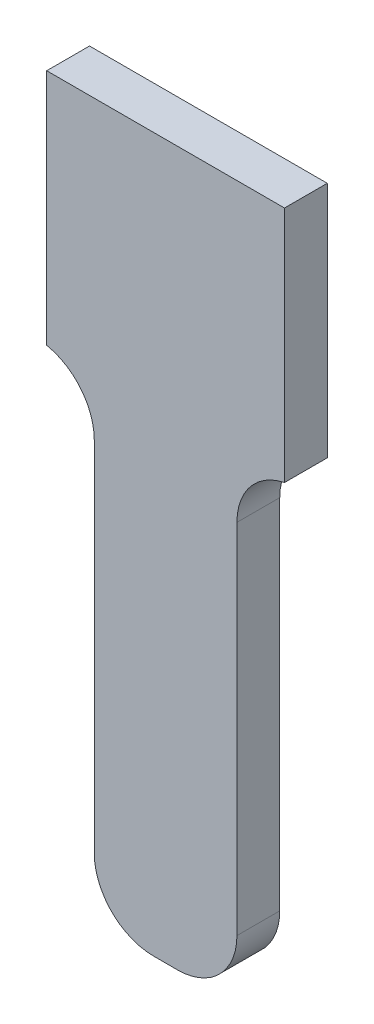
ISO-10303-21;
HEADER;
FILE_DESCRIPTION(('STEP AP214'),'2;1');
FILE_NAME('part.step','',(''),(''),'','','');
FILE_SCHEMA(('AUTOMOTIVE_DESIGN { 1 0 10303 214 1 1 1 1 }'));
ENDSEC;
DATA;
#1=APPLICATION_CONTEXT('core data for automotive mechanical design processes');
#2=APPLICATION_PROTOCOL_DEFINITION('international standard','automotive_design',2000,#1);
#3=PRODUCT_CONTEXT('',#1,'mechanical');
#4=PRODUCT('Part','Part','',(#3));
#5=PRODUCT_RELATED_PRODUCT_CATEGORY('part','',(#4));
#6=PRODUCT_DEFINITION_FORMATION('','',#4);
#7=PRODUCT_DEFINITION_CONTEXT('part definition',#1,'design');
#8=PRODUCT_DEFINITION('design','',#6,#7);
#9=PRODUCT_DEFINITION_SHAPE('','',#8);
#10=(LENGTH_UNIT() NAMED_UNIT(*) SI_UNIT(.MILLI.,.METRE.));
#11=(NAMED_UNIT(*) PLANE_ANGLE_UNIT() SI_UNIT($,.RADIAN.));
#12=(NAMED_UNIT(*) SI_UNIT($,.STERADIAN.) SOLID_ANGLE_UNIT());
#13=UNCERTAINTY_MEASURE_WITH_UNIT(LENGTH_MEASURE(1.E-05),#10,'distance_accuracy_value','');
#14=(GEOMETRIC_REPRESENTATION_CONTEXT(3) GLOBAL_UNCERTAINTY_ASSIGNED_CONTEXT((#13)) GLOBAL_UNIT_ASSIGNED_CONTEXT((#10,
#11,#12)) REPRESENTATION_CONTEXT('',''));
#15=CARTESIAN_POINT('',(0.,0.,0.));
#16=DIRECTION('',(0.,0.,1.));
#17=DIRECTION('',(1.,0.,0.));
#18=AXIS2_PLACEMENT_3D('',#15,#16,#17);
#19=CARTESIAN_POINT('',(3.81,0.,2.286));
#20=DIRECTION('',(1.,0.,0.));
#21=DIRECTION('',(0.,1.,0.));
#22=AXIS2_PLACEMENT_3D('',#19,#20,#21);
#23=PLANE('',#22);
#24=DIRECTION('',(0.,-1.,0.));
#25=VECTOR('',#24,1.);
#26=CARTESIAN_POINT('',(3.81,0.,2.286));
#27=LINE('',#26,#25);
#28=CARTESIAN_POINT('',(3.81,-9.46085197333464,2.286));
#29=VERTEX_POINT('',#28);
#30=CARTESIAN_POINT('',(3.81,-28.575,2.286));
#31=VERTEX_POINT('',#30);
#32=EDGE_CURVE('E126',#29,#31,#27,.T.);
#33=ORIENTED_EDGE('',*,*,#32,.T.);
#34=DIRECTION('',(0.,0.,-1.));
#35=VECTOR('',#34,1.);
#36=CARTESIAN_POINT('',(3.81,-28.575,0.));
#37=LINE('',#36,#35);
#38=CARTESIAN_POINT('',(3.81,-28.575,0.));
#39=VERTEX_POINT('',#38);
#40=EDGE_CURVE('E161',#31,#39,#37,.T.);
#41=ORIENTED_EDGE('',*,*,#40,.T.);
#42=DIRECTION('',(0.,-1.,0.));
#43=VECTOR('',#42,1.);
#44=CARTESIAN_POINT('',(3.81,0.,0.));
#45=LINE('',#44,#43);
#46=CARTESIAN_POINT('',(3.81,-9.46085197333464,0.));
#47=VERTEX_POINT('',#46);
#48=EDGE_CURVE('E171',#47,#39,#45,.T.);
#49=ORIENTED_EDGE('',*,*,#48,.F.);
#50=DIRECTION('',(0.,0.,1.));
#51=VECTOR('',#50,1.);
#52=CARTESIAN_POINT('',(3.81,-9.46085197333464,2.286));
#53=LINE('',#52,#51);
#54=EDGE_CURVE('E65',#47,#29,#53,.T.);
#55=ORIENTED_EDGE('',*,*,#54,.T.);
#56=EDGE_LOOP('',(#33,#41,#49,#55));
#57=FACE_BOUND('',#56,.T.);
#58=ADVANCED_FACE('F43',(#57),#23,.T.);
#59=CARTESIAN_POINT('',(6.35,0.,2.286));
#60=DIRECTION('',(1.,0.,0.));
#61=DIRECTION('',(0.,1.,0.));
#62=AXIS2_PLACEMENT_3D('',#59,#60,#61);
#63=PLANE('',#62);
#64=DIRECTION('',(0.,-1.,0.));
#65=VECTOR('',#64,1.);
#66=CARTESIAN_POINT('',(6.35,0.,0.));
#67=LINE('',#66,#65);
#68=CARTESIAN_POINT('',(6.35,6.35,0.));
#69=VERTEX_POINT('',#68);
#70=CARTESIAN_POINT('',(6.35,-6.35,0.));
#71=VERTEX_POINT('',#70);
#72=EDGE_CURVE('E173',#69,#71,#67,.T.);
#73=ORIENTED_EDGE('',*,*,#72,.F.);
#74=DIRECTION('',(0.,0.,-1.));
#75=VECTOR('',#74,1.);
#76=CARTESIAN_POINT('',(6.35,6.35,2.286));
#77=LINE('',#76,#75);
#78=CARTESIAN_POINT('',(6.35,6.35,2.286));
#79=VERTEX_POINT('',#78);
#80=EDGE_CURVE('E135',#79,#69,#77,.T.);
#81=ORIENTED_EDGE('',*,*,#80,.F.);
#82=DIRECTION('',(0.,-1.,0.));
#83=VECTOR('',#82,1.);
#84=CARTESIAN_POINT('',(6.35,0.,2.286));
#85=LINE('',#84,#83);
#86=CARTESIAN_POINT('',(6.35,-6.35,2.286));
#87=VERTEX_POINT('',#86);
#88=EDGE_CURVE('E124',#79,#87,#85,.T.);
#89=ORIENTED_EDGE('',*,*,#88,.T.);
#90=DIRECTION('',(0.,0.,-1.));
#91=VECTOR('',#90,1.);
#92=CARTESIAN_POINT('',(6.35,-6.35,2.286));
#93=LINE('',#92,#91);
#94=EDGE_CURVE('E133',#87,#71,#93,.T.);
#95=ORIENTED_EDGE('',*,*,#94,.T.);
#96=EDGE_LOOP('',(#73,#81,#89,#95));
#97=FACE_BOUND('',#96,.T.);
#98=ADVANCED_FACE('F132',(#97),#63,.T.);
#99=CARTESIAN_POINT('',(0.,6.35,2.286));
#100=DIRECTION('',(0.,1.,0.));
#101=DIRECTION('',(0.,0.,1.));
#102=AXIS2_PLACEMENT_3D('',#99,#100,#101);
#103=PLANE('',#102);
#104=DIRECTION('',(1.,0.,0.));
#105=VECTOR('',#104,1.);
#106=CARTESIAN_POINT('',(0.,6.35,0.));
#107=LINE('',#106,#105);
#108=CARTESIAN_POINT('',(-6.35,6.35,0.));
#109=VERTEX_POINT('',#108);
#110=EDGE_CURVE('E176',#109,#69,#107,.T.);
#111=ORIENTED_EDGE('',*,*,#110,.F.);
#112=DIRECTION('',(0.,0.,-1.));
#113=VECTOR('',#112,1.);
#114=CARTESIAN_POINT('',(-6.35,6.35,2.286));
#115=LINE('',#114,#113);
#116=CARTESIAN_POINT('',(-6.35,6.35,2.286));
#117=VERTEX_POINT('',#116);
#118=EDGE_CURVE('E142',#117,#109,#115,.T.);
#119=ORIENTED_EDGE('',*,*,#118,.F.);
#120=DIRECTION('',(1.,0.,0.));
#121=VECTOR('',#120,1.);
#122=CARTESIAN_POINT('',(0.,6.35,2.286));
#123=LINE('',#122,#121);
#124=EDGE_CURVE('E136',#117,#79,#123,.T.);
#125=ORIENTED_EDGE('',*,*,#124,.T.);
#126=ORIENTED_EDGE('',*,*,#80,.T.);
#127=EDGE_LOOP('',(#111,#119,#125,#126));
#128=FACE_BOUND('',#127,.T.);
#129=ADVANCED_FACE('F203',(#128),#103,.T.);
#130=CARTESIAN_POINT('',(-6.35,0.,2.286));
#131=DIRECTION('',(1.,0.,0.));
#132=DIRECTION('',(0.,1.,0.));
#133=AXIS2_PLACEMENT_3D('',#130,#131,#132);
#134=PLANE('',#133);
#135=DIRECTION('',(0.,-1.,0.));
#136=VECTOR('',#135,1.);
#137=CARTESIAN_POINT('',(-6.35,0.,0.));
#138=LINE('',#137,#136);
#139=CARTESIAN_POINT('',(-6.35,-6.35,0.));
#140=VERTEX_POINT('',#139);
#141=EDGE_CURVE('E183',#109,#140,#138,.T.);
#142=ORIENTED_EDGE('',*,*,#141,.T.);
#143=DIRECTION('',(0.,0.,-1.));
#144=VECTOR('',#143,1.);
#145=CARTESIAN_POINT('',(-6.35,-6.35,2.286));
#146=LINE('',#145,#144);
#147=CARTESIAN_POINT('',(-6.35,-6.35,2.286));
#148=VERTEX_POINT('',#147);
#149=EDGE_CURVE('E192',#148,#140,#146,.T.);
#150=ORIENTED_EDGE('',*,*,#149,.F.);
#151=DIRECTION('',(0.,-1.,0.));
#152=VECTOR('',#151,1.);
#153=CARTESIAN_POINT('',(-6.35,0.,2.286));
#154=LINE('',#153,#152);
#155=EDGE_CURVE('E199',#117,#148,#154,.T.);
#156=ORIENTED_EDGE('',*,*,#155,.F.);
#157=ORIENTED_EDGE('',*,*,#118,.T.);
#158=EDGE_LOOP('',(#142,#150,#156,#157));
#159=FACE_BOUND('',#158,.T.);
#160=ADVANCED_FACE('F197',(#159),#134,.F.);
#161=CARTESIAN_POINT('',(-3.81,0.,2.286));
#162=DIRECTION('',(1.,0.,0.));
#163=DIRECTION('',(0.,1.,0.));
#164=AXIS2_PLACEMENT_3D('',#161,#162,#163);
#165=PLANE('',#164);
#166=DIRECTION('',(0.,-1.,0.));
#167=VECTOR('',#166,1.);
#168=CARTESIAN_POINT('',(-3.81,0.,0.));
#169=LINE('',#168,#167);
#170=CARTESIAN_POINT('',(-3.81,-9.46085197333464,0.));
#171=VERTEX_POINT('',#170);
#172=CARTESIAN_POINT('',(-3.81,-28.575,0.));
#173=VERTEX_POINT('',#172);
#174=EDGE_CURVE('E186',#171,#173,#169,.T.);
#175=ORIENTED_EDGE('',*,*,#174,.T.);
#176=DIRECTION('',(0.,0.,-1.));
#177=VECTOR('',#176,1.);
#178=CARTESIAN_POINT('',(-3.81,-28.575,2.286));
#179=LINE('',#178,#177);
#180=CARTESIAN_POINT('',(-3.81,-28.575,2.286));
#181=VERTEX_POINT('',#180);
#182=EDGE_CURVE('E155',#173,#181,#179,.F.);
#183=ORIENTED_EDGE('',*,*,#182,.T.);
#184=DIRECTION('',(0.,-1.,0.));
#185=VECTOR('',#184,1.);
#186=CARTESIAN_POINT('',(-3.81,0.,2.286));
#187=LINE('',#186,#185);
#188=CARTESIAN_POINT('',(-3.81,-9.46085197333464,2.286));
#189=VERTEX_POINT('',#188);
#190=EDGE_CURVE('E205',#189,#181,#187,.T.);
#191=ORIENTED_EDGE('',*,*,#190,.F.);
#192=DIRECTION('',(0.,0.,-1.));
#193=VECTOR('',#192,1.);
#194=CARTESIAN_POINT('',(-3.81,-9.46085197333464,2.286));
#195=LINE('',#194,#193);
#196=EDGE_CURVE('E152',#189,#171,#195,.T.);
#197=ORIENTED_EDGE('',*,*,#196,.T.);
#198=EDGE_LOOP('',(#175,#183,#191,#197));
#199=FACE_BOUND('',#198,.T.);
#200=ADVANCED_FACE('F221',(#199),#165,.F.);
#201=CARTESIAN_POINT('',(0.,-31.75,2.286));
#202=DIRECTION('',(0.,1.,0.));
#203=DIRECTION('',(0.,0.,1.));
#204=AXIS2_PLACEMENT_3D('',#201,#202,#203);
#205=PLANE('',#204);
#206=DIRECTION('',(1.,0.,0.));
#207=VECTOR('',#206,1.);
#208=CARTESIAN_POINT('',(0.,-31.75,2.286));
#209=LINE('',#208,#207);
#210=CARTESIAN_POINT('',(-0.635,-31.75,2.286));
#211=VERTEX_POINT('',#210);
#212=CARTESIAN_POINT('',(0.635,-31.75,2.286));
#213=VERTEX_POINT('',#212);
#214=EDGE_CURVE('E179',#211,#213,#209,.T.);
#215=ORIENTED_EDGE('',*,*,#214,.F.);
#216=DIRECTION('',(0.,0.,-1.));
#217=VECTOR('',#216,1.);
#218=CARTESIAN_POINT('',(-0.635,-31.75,2.286));
#219=LINE('',#218,#217);
#220=CARTESIAN_POINT('',(-0.635,-31.75,0.));
#221=VERTEX_POINT('',#220);
#222=EDGE_CURVE('E140',#211,#221,#219,.T.);
#223=ORIENTED_EDGE('',*,*,#222,.T.);
#224=DIRECTION('',(1.,0.,0.));
#225=VECTOR('',#224,1.);
#226=CARTESIAN_POINT('',(0.,-31.75,0.));
#227=LINE('',#226,#225);
#228=CARTESIAN_POINT('',(0.635,-31.75,0.));
#229=VERTEX_POINT('',#228);
#230=EDGE_CURVE('E189',#221,#229,#227,.T.);
#231=ORIENTED_EDGE('',*,*,#230,.T.);
#232=DIRECTION('',(0.,0.,-1.));
#233=VECTOR('',#232,1.);
#234=CARTESIAN_POINT('',(0.635,-31.75,2.286));
#235=LINE('',#234,#233);
#236=EDGE_CURVE('E138',#229,#213,#235,.F.);
#237=ORIENTED_EDGE('',*,*,#236,.T.);
#238=EDGE_LOOP('',(#215,#223,#231,#237));
#239=FACE_BOUND('',#238,.T.);
#240=ADVANCED_FACE('F216',(#239),#205,.F.);
#241=CARTESIAN_POINT('',(0.,0.,2.286));
#242=DIRECTION('',(0.,0.,1.));
#243=DIRECTION('',(1.,0.,0.));
#244=AXIS2_PLACEMENT_3D('',#241,#242,#243);
#245=PLANE('',#244);
#246=ORIENTED_EDGE('',*,*,#190,.T.);
#247=CARTESIAN_POINT('',(-0.635,-28.575,2.286));
#248=DIRECTION('',(0.,0.,1.));
#249=DIRECTION('',(1.,0.,0.));
#250=AXIS2_PLACEMENT_3D('',#247,#248,#249);
#251=CIRCLE('',#250,3.175);
#252=EDGE_CURVE('E158',#181,#211,#251,.T.);
#253=ORIENTED_EDGE('',*,*,#252,.T.);
#254=ORIENTED_EDGE('',*,*,#214,.T.);
#255=CARTESIAN_POINT('',(0.635,-28.575,2.286));
#256=DIRECTION('',(0.,0.,1.));
#257=DIRECTION('',(1.,0.,0.));
#258=AXIS2_PLACEMENT_3D('',#255,#256,#257);
#259=CIRCLE('',#258,3.175);
#260=EDGE_CURVE('E58',#213,#31,#259,.T.);
#261=ORIENTED_EDGE('',*,*,#260,.T.);
#262=ORIENTED_EDGE('',*,*,#32,.F.);
#263=CARTESIAN_POINT('',(6.985,-9.46085197333464,2.286));
#264=DIRECTION('',(0.,0.,1.));
#265=DIRECTION('',(1.,0.,0.));
#266=AXIS2_PLACEMENT_3D('',#263,#264,#265);
#267=CIRCLE('',#266,3.175);
#268=EDGE_CURVE('E11',#29,#87,#267,.F.);
#269=ORIENTED_EDGE('',*,*,#268,.T.);
#270=ORIENTED_EDGE('',*,*,#88,.F.);
#271=ORIENTED_EDGE('',*,*,#124,.F.);
#272=ORIENTED_EDGE('',*,*,#155,.T.);
#273=CARTESIAN_POINT('',(-6.985,-9.46085197333464,2.286));
#274=DIRECTION('',(0.,0.,1.));
#275=DIRECTION('',(1.,0.,0.));
#276=AXIS2_PLACEMENT_3D('',#273,#274,#275);
#277=CIRCLE('',#276,3.175);
#278=EDGE_CURVE('E166',#148,#189,#277,.F.);
#279=ORIENTED_EDGE('',*,*,#278,.T.);
#280=EDGE_LOOP('',(#246,#253,#254,#261,#262,#269,#270,#271,#272,#279));
#281=FACE_BOUND('',#280,.T.);
#282=ADVANCED_FACE('F122',(#281),#245,.T.);
#283=CARTESIAN_POINT('',(0.,0.,0.));
#284=DIRECTION('',(0.,0.,1.));
#285=DIRECTION('',(1.,0.,0.));
#286=AXIS2_PLACEMENT_3D('',#283,#284,#285);
#287=PLANE('',#286);
#288=ORIENTED_EDGE('',*,*,#230,.F.);
#289=CARTESIAN_POINT('',(-0.635,-28.575,0.));
#290=DIRECTION('',(0.,0.,1.));
#291=DIRECTION('',(1.,0.,0.));
#292=AXIS2_PLACEMENT_3D('',#289,#290,#291);
#293=CIRCLE('',#292,3.175);
#294=EDGE_CURVE('E150',#221,#173,#293,.F.);
#295=ORIENTED_EDGE('',*,*,#294,.T.);
#296=ORIENTED_EDGE('',*,*,#174,.F.);
#297=CARTESIAN_POINT('',(-6.985,-9.46085197333464,0.));
#298=DIRECTION('',(0.,0.,1.));
#299=DIRECTION('',(1.,0.,0.));
#300=AXIS2_PLACEMENT_3D('',#297,#298,#299);
#301=CIRCLE('',#300,3.175);
#302=EDGE_CURVE('E164',#171,#140,#301,.T.);
#303=ORIENTED_EDGE('',*,*,#302,.T.);
#304=ORIENTED_EDGE('',*,*,#141,.F.);
#305=ORIENTED_EDGE('',*,*,#110,.T.);
#306=ORIENTED_EDGE('',*,*,#72,.T.);
#307=CARTESIAN_POINT('',(6.985,-9.46085197333464,0.));
#308=DIRECTION('',(0.,0.,1.));
#309=DIRECTION('',(1.,0.,0.));
#310=AXIS2_PLACEMENT_3D('',#307,#308,#309);
#311=CIRCLE('',#310,3.175);
#312=EDGE_CURVE('E51',#71,#47,#311,.T.);
#313=ORIENTED_EDGE('',*,*,#312,.T.);
#314=ORIENTED_EDGE('',*,*,#48,.T.);
#315=CARTESIAN_POINT('',(0.635,-28.575,0.));
#316=DIRECTION('',(0.,0.,1.));
#317=DIRECTION('',(1.,0.,0.));
#318=AXIS2_PLACEMENT_3D('',#315,#316,#317);
#319=CIRCLE('',#318,3.175);
#320=EDGE_CURVE('E148',#39,#229,#319,.F.);
#321=ORIENTED_EDGE('',*,*,#320,.T.);
#322=EDGE_LOOP('',(#288,#295,#296,#303,#304,#305,#306,#313,#314,#321));
#323=FACE_BOUND('',#322,.T.);
#324=ADVANCED_FACE('F170',(#323),#287,.F.);
#325=CARTESIAN_POINT('',(-0.635,-28.575,2.286));
#326=DIRECTION('',(0.,0.,-1.));
#327=DIRECTION('',(-1.,0.,0.));
#328=AXIS2_PLACEMENT_3D('',#325,#326,#327);
#329=CYLINDRICAL_SURFACE('',#328,3.175);
#330=ORIENTED_EDGE('',*,*,#252,.F.);
#331=ORIENTED_EDGE('',*,*,#182,.F.);
#332=ORIENTED_EDGE('',*,*,#294,.F.);
#333=ORIENTED_EDGE('',*,*,#222,.F.);
#334=EDGE_LOOP('',(#330,#331,#332,#333));
#335=FACE_BOUND('',#334,.T.);
#336=ADVANCED_FACE('F218',(#335),#329,.T.);
#337=CARTESIAN_POINT('',(0.635,-28.575,2.286));
#338=DIRECTION('',(0.,0.,1.));
#339=DIRECTION('',(1.,0.,0.));
#340=AXIS2_PLACEMENT_3D('',#337,#338,#339);
#341=CYLINDRICAL_SURFACE('',#340,3.175);
#342=ORIENTED_EDGE('',*,*,#260,.F.);
#343=ORIENTED_EDGE('',*,*,#236,.F.);
#344=ORIENTED_EDGE('',*,*,#320,.F.);
#345=ORIENTED_EDGE('',*,*,#40,.F.);
#346=EDGE_LOOP('',(#342,#343,#344,#345));
#347=FACE_BOUND('',#346,.T.);
#348=ADVANCED_FACE('F215',(#347),#341,.T.);
#349=CARTESIAN_POINT('',(-6.985,-9.46085197333464,2.286));
#350=DIRECTION('',(0.,0.,-1.));
#351=DIRECTION('',(-1.,0.,0.));
#352=AXIS2_PLACEMENT_3D('',#349,#350,#351);
#353=CYLINDRICAL_SURFACE('',#352,3.175);
#354=ORIENTED_EDGE('',*,*,#278,.F.);
#355=ORIENTED_EDGE('',*,*,#149,.T.);
#356=ORIENTED_EDGE('',*,*,#302,.F.);
#357=ORIENTED_EDGE('',*,*,#196,.F.);
#358=EDGE_LOOP('',(#354,#355,#356,#357));
#359=FACE_BOUND('',#358,.T.);
#360=ADVANCED_FACE('F225',(#359),#353,.F.);
#361=CARTESIAN_POINT('',(6.985,-9.46085197333464,2.286));
#362=DIRECTION('',(0.,0.,-1.));
#363=DIRECTION('',(-1.,0.,0.));
#364=AXIS2_PLACEMENT_3D('',#361,#362,#363);
#365=CYLINDRICAL_SURFACE('',#364,3.175);
#366=ORIENTED_EDGE('',*,*,#268,.F.);
#367=ORIENTED_EDGE('',*,*,#54,.F.);
#368=ORIENTED_EDGE('',*,*,#312,.F.);
#369=ORIENTED_EDGE('',*,*,#94,.F.);
#370=EDGE_LOOP('',(#366,#367,#368,#369));
#371=FACE_BOUND('',#370,.T.);
#372=ADVANCED_FACE('F45',(#371),#365,.F.);
#373=CLOSED_SHELL('',(#58,#98,#129,#160,#200,#240,#282,#324,#336,#348,#360,#372));
#374=MANIFOLD_SOLID_BREP('B2',#373);
#375=ADVANCED_BREP_SHAPE_REPRESENTATION('',(#18,#374),#14);
#376=SHAPE_DEFINITION_REPRESENTATION(#9,#375);
ENDSEC;
END-ISO-10303-21;
